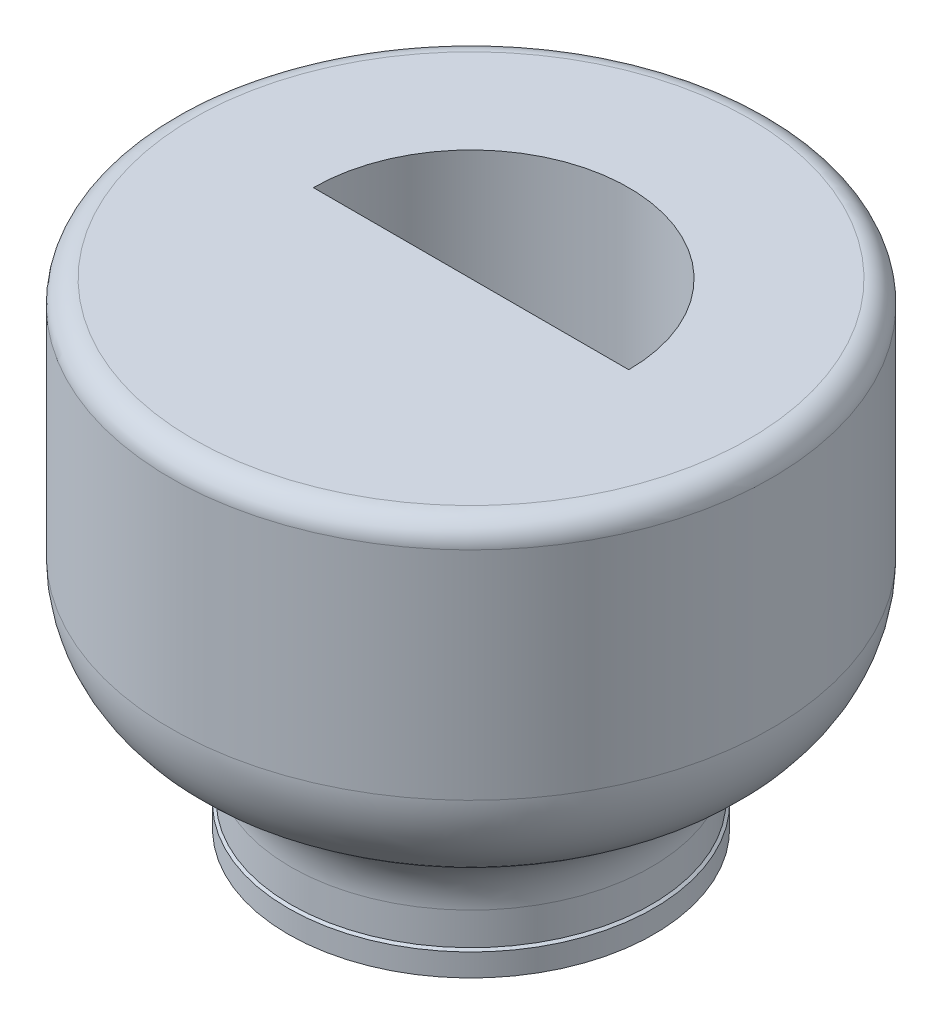
ISO-10303-21;
HEADER;
FILE_DESCRIPTION(('STEP AP214'),'2;1');
FILE_NAME('part.step','',(''),(''),'','','');
FILE_SCHEMA(('AUTOMOTIVE_DESIGN { 1 0 10303 214 1 1 1 1 }'));
ENDSEC;
DATA;
#1=APPLICATION_CONTEXT('core data for automotive mechanical design processes');
#2=APPLICATION_PROTOCOL_DEFINITION('international standard','automotive_design',2000,#1);
#3=PRODUCT_CONTEXT('',#1,'mechanical');
#4=PRODUCT('Part','Part','',(#3));
#5=PRODUCT_RELATED_PRODUCT_CATEGORY('part','',(#4));
#6=PRODUCT_DEFINITION_FORMATION('','',#4);
#7=PRODUCT_DEFINITION_CONTEXT('part definition',#1,'design');
#8=PRODUCT_DEFINITION('design','',#6,#7);
#9=PRODUCT_DEFINITION_SHAPE('','',#8);
#10=(LENGTH_UNIT() NAMED_UNIT(*) SI_UNIT(.MILLI.,.METRE.));
#11=(NAMED_UNIT(*) PLANE_ANGLE_UNIT() SI_UNIT($,.RADIAN.));
#12=(NAMED_UNIT(*) SI_UNIT($,.STERADIAN.) SOLID_ANGLE_UNIT());
#13=UNCERTAINTY_MEASURE_WITH_UNIT(LENGTH_MEASURE(1.E-05),#10,'distance_accuracy_value','');
#14=(GEOMETRIC_REPRESENTATION_CONTEXT(3) GLOBAL_UNCERTAINTY_ASSIGNED_CONTEXT((#13)) GLOBAL_UNIT_ASSIGNED_CONTEXT((#10,
#11,#12)) REPRESENTATION_CONTEXT('',''));
#15=CARTESIAN_POINT('',(0.,0.,0.));
#16=DIRECTION('',(0.,0.,1.));
#17=DIRECTION('',(1.,0.,0.));
#18=AXIS2_PLACEMENT_3D('',#15,#16,#17);
#19=CARTESIAN_POINT('',(0.,0.,0.));
#20=DIRECTION('',(0.,-1.,0.));
#21=DIRECTION('',(0.,0.,-1.));
#22=AXIS2_PLACEMENT_3D('',#19,#20,#21);
#23=CYLINDRICAL_SURFACE('',#22,22.5);
#24=CARTESIAN_POINT('',(0.,0.,0.));
#25=DIRECTION('',(0.,-1.,0.));
#26=DIRECTION('',(0.,0.,-1.));
#27=AXIS2_PLACEMENT_3D('',#24,#25,#26);
#28=CIRCLE('',#27,22.5);
#29=CARTESIAN_POINT('',(0.,0.,-22.5));
#30=VERTEX_POINT('',#29);
#31=EDGE_CURVE('E121',#30,#30,#28,.T.);
#32=ORIENTED_EDGE('',*,*,#31,.T.);
#33=EDGE_LOOP('',(#32));
#34=FACE_BOUND('',#33,.T.);
#35=CARTESIAN_POINT('',(0.,12.5,0.));
#36=DIRECTION('',(0.,-1.,0.));
#37=DIRECTION('',(0.,0.,-1.));
#38=AXIS2_PLACEMENT_3D('',#35,#36,#37);
#39=CIRCLE('',#38,22.5);
#40=CARTESIAN_POINT('',(0.,12.5,-22.5));
#41=VERTEX_POINT('',#40);
#42=EDGE_CURVE('E167',#41,#41,#39,.T.);
#43=ORIENTED_EDGE('',*,*,#42,.F.);
#44=EDGE_LOOP('',(#43));
#45=FACE_BOUND('',#44,.T.);
#46=ADVANCED_FACE('F42',(#34,#45),#23,.F.);
#47=CARTESIAN_POINT('',(0.,12.5,0.));
#48=DIRECTION('',(0.,-1.,0.));
#49=DIRECTION('',(0.,0.,-1.));
#50=AXIS2_PLACEMENT_3D('',#47,#48,#49);
#51=TOROIDAL_SURFACE('',#50,22.,0.5);
#52=ORIENTED_EDGE('',*,*,#42,.T.);
#53=EDGE_LOOP('',(#52));
#54=FACE_BOUND('',#53,.T.);
#55=CARTESIAN_POINT('',(0.,13.,0.));
#56=DIRECTION('',(0.,-1.,0.));
#57=DIRECTION('',(0.,0.,-1.));
#58=AXIS2_PLACEMENT_3D('',#55,#56,#57);
#59=CIRCLE('',#58,22.);
#60=CARTESIAN_POINT('',(0.,13.,-22.));
#61=VERTEX_POINT('',#60);
#62=EDGE_CURVE('E163',#61,#61,#59,.T.);
#63=ORIENTED_EDGE('',*,*,#62,.F.);
#64=EDGE_LOOP('',(#63));
#65=FACE_BOUND('',#64,.T.);
#66=ADVANCED_FACE('F240',(#54,#65),#51,.F.);
#67=CARTESIAN_POINT('',(0.,13.,0.));
#68=DIRECTION('',(0.,-1.,0.));
#69=DIRECTION('',(0.,0.,-1.));
#70=AXIS2_PLACEMENT_3D('',#67,#68,#69);
#71=PLANE('',#70);
#72=CARTESIAN_POINT('',(0.,13.,0.));
#73=DIRECTION('',(0.,-1.,0.));
#74=DIRECTION('',(0.,0.,1.));
#75=AXIS2_PLACEMENT_3D('',#72,#73,#74);
#76=CIRCLE('',#75,21.);
#77=CARTESIAN_POINT('',(-21.,13.,0.));
#78=VERTEX_POINT('',#77);
#79=CARTESIAN_POINT('',(21.,13.,0.));
#80=VERTEX_POINT('',#79);
#81=EDGE_CURVE('E57',#78,#80,#76,.T.);
#82=ORIENTED_EDGE('',*,*,#81,.F.);
#83=DIRECTION('',(-1.,0.,0.));
#84=VECTOR('',#83,1.);
#85=CARTESIAN_POINT('',(21.,13.,0.));
#86=LINE('',#85,#84);
#87=EDGE_CURVE('E115',#80,#78,#86,.T.);
#88=ORIENTED_EDGE('',*,*,#87,.F.);
#89=EDGE_LOOP('',(#82,#88));
#90=FACE_BOUND('',#89,.T.);
#91=ORIENTED_EDGE('',*,*,#62,.T.);
#92=EDGE_LOOP('',(#91));
#93=FACE_BOUND('',#92,.T.);
#94=ADVANCED_FACE('F181',(#90,#93),#71,.T.);
#95=CARTESIAN_POINT('',(0.,63.4278760968653,0.));
#96=DIRECTION('',(0.,1.,0.));
#97=DIRECTION('',(0.,0.,1.));
#98=AXIS2_PLACEMENT_3D('',#95,#96,#97);
#99=PLANE('',#98);
#100=CARTESIAN_POINT('',(0.,63.4278760968653,0.));
#101=DIRECTION('',(0.,1.,0.));
#102=DIRECTION('',(0.,0.,1.));
#103=AXIS2_PLACEMENT_3D('',#100,#101,#102);
#104=CIRCLE('',#103,21.);
#105=CARTESIAN_POINT('',(21.,63.4278760968653,0.));
#106=VERTEX_POINT('',#105);
#107=CARTESIAN_POINT('',(-21.,63.4278760968653,0.));
#108=VERTEX_POINT('',#107);
#109=EDGE_CURVE('E11',#106,#108,#104,.T.);
#110=ORIENTED_EDGE('',*,*,#109,.F.);
#111=DIRECTION('',(1.,0.,0.));
#112=VECTOR('',#111,1.);
#113=CARTESIAN_POINT('',(0.,63.4278760968653,0.));
#114=LINE('',#113,#112);
#115=EDGE_CURVE('E50',#108,#106,#114,.T.);
#116=ORIENTED_EDGE('',*,*,#115,.F.);
#117=EDGE_LOOP('',(#110,#116));
#118=FACE_BOUND('',#117,.T.);
#119=CARTESIAN_POINT('',(0.,63.4278760968653,0.));
#120=DIRECTION('',(0.,-1.,0.));
#121=DIRECTION('',(0.,0.,-1.));
#122=AXIS2_PLACEMENT_3D('',#119,#120,#121);
#123=CIRCLE('',#122,37.);
#124=CARTESIAN_POINT('',(0.,63.4278760968653,-37.));
#125=VERTEX_POINT('',#124);
#126=EDGE_CURVE('E159',#125,#125,#123,.T.);
#127=ORIENTED_EDGE('',*,*,#126,.F.);
#128=EDGE_LOOP('',(#127));
#129=FACE_BOUND('',#128,.T.);
#130=ADVANCED_FACE('F177',(#118,#129),#99,.T.);
#131=CARTESIAN_POINT('',(0.,60.4278760968653,0.));
#132=DIRECTION('',(0.,-1.,0.));
#133=DIRECTION('',(0.,0.,-1.));
#134=AXIS2_PLACEMENT_3D('',#131,#132,#133);
#135=TOROIDAL_SURFACE('',#134,37.,3.);
#136=ORIENTED_EDGE('',*,*,#126,.T.);
#137=EDGE_LOOP('',(#136));
#138=FACE_BOUND('',#137,.T.);
#139=CARTESIAN_POINT('',(0.,60.4278760968653,0.));
#140=DIRECTION('',(0.,-1.,0.));
#141=DIRECTION('',(0.,0.,-1.));
#142=AXIS2_PLACEMENT_3D('',#139,#140,#141);
#143=CIRCLE('',#142,40.);
#144=CARTESIAN_POINT('',(0.,60.4278760968653,-40.));
#145=VERTEX_POINT('',#144);
#146=EDGE_CURVE('E155',#145,#145,#143,.T.);
#147=ORIENTED_EDGE('',*,*,#146,.F.);
#148=EDGE_LOOP('',(#147));
#149=FACE_BOUND('',#148,.T.);
#150=ADVANCED_FACE('F180',(#138,#149),#135,.T.);
#151=CARTESIAN_POINT('',(0.,0.,0.));
#152=DIRECTION('',(0.,-1.,0.));
#153=DIRECTION('',(0.,0.,-1.));
#154=AXIS2_PLACEMENT_3D('',#151,#152,#153);
#155=CYLINDRICAL_SURFACE('',#154,40.);
#156=ORIENTED_EDGE('',*,*,#146,.T.);
#157=EDGE_LOOP('',(#156));
#158=FACE_BOUND('',#157,.T.);
#159=CARTESIAN_POINT('',(0.,31.5562889655761,0.));
#160=DIRECTION('',(0.,-1.,0.));
#161=DIRECTION('',(0.,0.,-1.));
#162=AXIS2_PLACEMENT_3D('',#159,#160,#161);
#163=CIRCLE('',#162,40.);
#164=CARTESIAN_POINT('',(0.,31.5562889655761,-40.));
#165=VERTEX_POINT('',#164);
#166=EDGE_CURVE('E151',#165,#165,#163,.T.);
#167=ORIENTED_EDGE('',*,*,#166,.F.);
#168=EDGE_LOOP('',(#167));
#169=FACE_BOUND('',#168,.T.);
#170=ADVANCED_FACE('F187',(#158,#169),#155,.T.);
#171=CARTESIAN_POINT('',(0.,31.5562889655761,0.));
#172=DIRECTION('',(0.,-1.,0.));
#173=DIRECTION('',(0.,0.,-1.));
#174=AXIS2_PLACEMENT_3D('',#171,#172,#173);
#175=TOROIDAL_SURFACE('',#174,25.,15.);
#176=ORIENTED_EDGE('',*,*,#166,.T.);
#177=EDGE_LOOP('',(#176));
#178=FACE_BOUND('',#177,.T.);
#179=CARTESIAN_POINT('',(0.,18.9896485668923,0.));
#180=DIRECTION('',(0.,-1.,0.));
#181=DIRECTION('',(0.,0.,-1.));
#182=AXIS2_PLACEMENT_3D('',#179,#180,#181);
#183=CIRCLE('',#182,33.1902105644586);
#184=CARTESIAN_POINT('',(0.,18.9896485668923,-33.1902105644586));
#185=VERTEX_POINT('',#184);
#186=EDGE_CURVE('E147',#185,#185,#183,.T.);
#187=ORIENTED_EDGE('',*,*,#186,.F.);
#188=EDGE_LOOP('',(#187));
#189=FACE_BOUND('',#188,.T.);
#190=ADVANCED_FACE('F193',(#178,#189),#175,.T.);
#191=CARTESIAN_POINT('',(0.,15.9588183533154,0.));
#192=DIRECTION('',(0.,1.,0.));
#193=DIRECTION('',(0.,0.,1.));
#194=AXIS2_PLACEMENT_3D('',#191,#192,#193);
#195=CONICAL_SURFACE('',#194,28.5398596236943,0.993197296529964);
#196=ORIENTED_EDGE('',*,*,#186,.T.);
#197=EDGE_LOOP('',(#196));
#198=FACE_BOUND('',#197,.T.);
#199=CARTESIAN_POINT('',(0.,15.9588183533154,0.));
#200=DIRECTION('',(0.,-1.,0.));
#201=DIRECTION('',(0.,0.,-1.));
#202=AXIS2_PLACEMENT_3D('',#199,#200,#201);
#203=CIRCLE('',#202,28.5398596236943);
#204=CARTESIAN_POINT('',(0.,15.9588183533154,-28.5398596236943));
#205=VERTEX_POINT('',#204);
#206=EDGE_CURVE('E143',#205,#205,#203,.T.);
#207=ORIENTED_EDGE('',*,*,#206,.F.);
#208=EDGE_LOOP('',(#207));
#209=FACE_BOUND('',#208,.T.);
#210=ADVANCED_FACE('F199',(#198,#209),#195,.T.);
#211=CARTESIAN_POINT('',(0.,7.58105808752617,0.));
#212=DIRECTION('',(0.,-1.,0.));
#213=DIRECTION('',(0.,0.,-1.));
#214=AXIS2_PLACEMENT_3D('',#211,#212,#213);
#215=TOROIDAL_SURFACE('',#214,34.,10.);
#216=ORIENTED_EDGE('',*,*,#206,.T.);
#217=EDGE_LOOP('',(#216));
#218=FACE_BOUND('',#217,.T.);
#219=CARTESIAN_POINT('',(0.,7.58105808752612,0.));
#220=DIRECTION('',(0.,-1.,0.));
#221=DIRECTION('',(0.,0.,-1.));
#222=AXIS2_PLACEMENT_3D('',#219,#220,#221);
#223=CIRCLE('',#222,24.);
#224=CARTESIAN_POINT('',(0.,7.58105808752612,-24.));
#225=VERTEX_POINT('',#224);
#226=EDGE_CURVE('E139',#225,#225,#223,.T.);
#227=ORIENTED_EDGE('',*,*,#226,.F.);
#228=EDGE_LOOP('',(#227));
#229=FACE_BOUND('',#228,.T.);
#230=ADVANCED_FACE('F205',(#218,#229),#215,.F.);
#231=CARTESIAN_POINT('',(0.,0.,0.));
#232=DIRECTION('',(0.,-1.,0.));
#233=DIRECTION('',(0.,0.,-1.));
#234=AXIS2_PLACEMENT_3D('',#231,#232,#233);
#235=CYLINDRICAL_SURFACE('',#234,24.);
#236=ORIENTED_EDGE('',*,*,#226,.T.);
#237=EDGE_LOOP('',(#236));
#238=FACE_BOUND('',#237,.T.);
#239=CARTESIAN_POINT('',(0.,3.25,0.));
#240=DIRECTION('',(0.,-1.,0.));
#241=DIRECTION('',(0.,0.,-1.));
#242=AXIS2_PLACEMENT_3D('',#239,#240,#241);
#243=CIRCLE('',#242,24.);
#244=CARTESIAN_POINT('',(0.,3.25,-24.));
#245=VERTEX_POINT('',#244);
#246=EDGE_CURVE('E135',#245,#245,#243,.T.);
#247=ORIENTED_EDGE('',*,*,#246,.F.);
#248=EDGE_LOOP('',(#247));
#249=FACE_BOUND('',#248,.T.);
#250=ADVANCED_FACE('F211',(#238,#249),#235,.T.);
#251=CARTESIAN_POINT('',(0.,3.,0.));
#252=DIRECTION('',(0.,-1.,0.));
#253=DIRECTION('',(0.,0.,-1.));
#254=AXIS2_PLACEMENT_3D('',#251,#252,#253);
#255=CONICAL_SURFACE('',#254,24.35,0.950546840812071);
#256=ORIENTED_EDGE('',*,*,#246,.T.);
#257=EDGE_LOOP('',(#256));
#258=FACE_BOUND('',#257,.T.);
#259=CARTESIAN_POINT('',(0.,3.,0.));
#260=DIRECTION('',(0.,-1.,0.));
#261=DIRECTION('',(0.,0.,-1.));
#262=AXIS2_PLACEMENT_3D('',#259,#260,#261);
#263=CIRCLE('',#262,24.35);
#264=CARTESIAN_POINT('',(0.,3.,-24.35));
#265=VERTEX_POINT('',#264);
#266=EDGE_CURVE('E131',#265,#265,#263,.T.);
#267=ORIENTED_EDGE('',*,*,#266,.F.);
#268=EDGE_LOOP('',(#267));
#269=FACE_BOUND('',#268,.T.);
#270=ADVANCED_FACE('F217',(#258,#269),#255,.T.);
#271=CARTESIAN_POINT('',(0.,0.,0.));
#272=DIRECTION('',(0.,-1.,0.));
#273=DIRECTION('',(0.,0.,-1.));
#274=AXIS2_PLACEMENT_3D('',#271,#272,#273);
#275=CYLINDRICAL_SURFACE('',#274,24.35);
#276=ORIENTED_EDGE('',*,*,#266,.T.);
#277=EDGE_LOOP('',(#276));
#278=FACE_BOUND('',#277,.T.);
#279=CARTESIAN_POINT('',(0.,0.,0.));
#280=DIRECTION('',(0.,-1.,0.));
#281=DIRECTION('',(0.,0.,-1.));
#282=AXIS2_PLACEMENT_3D('',#279,#280,#281);
#283=CIRCLE('',#282,24.35);
#284=CARTESIAN_POINT('',(0.,0.,-24.35));
#285=VERTEX_POINT('',#284);
#286=EDGE_CURVE('E127',#285,#285,#283,.T.);
#287=ORIENTED_EDGE('',*,*,#286,.F.);
#288=EDGE_LOOP('',(#287));
#289=FACE_BOUND('',#288,.T.);
#290=ADVANCED_FACE('F223',(#278,#289),#275,.T.);
#291=CARTESIAN_POINT('',(22.5,0.,0.));
#292=DIRECTION('',(0.,-1.,0.));
#293=DIRECTION('',(0.,0.,-1.));
#294=AXIS2_PLACEMENT_3D('',#291,#292,#293);
#295=PLANE('',#294);
#296=ORIENTED_EDGE('',*,*,#286,.T.);
#297=EDGE_LOOP('',(#296));
#298=FACE_BOUND('',#297,.T.);
#299=ORIENTED_EDGE('',*,*,#31,.F.);
#300=EDGE_LOOP('',(#299));
#301=FACE_BOUND('',#300,.T.);
#302=ADVANCED_FACE('F229',(#298,#301),#295,.T.);
#303=CARTESIAN_POINT('',(0.,73.,0.));
#304=DIRECTION('',(0.,-1.,0.));
#305=DIRECTION('',(0.,0.,-1.));
#306=AXIS2_PLACEMENT_3D('',#303,#304,#305);
#307=CYLINDRICAL_SURFACE('',#306,21.);
#308=ORIENTED_EDGE('',*,*,#109,.T.);
#309=DIRECTION('',(0.,-1.,0.));
#310=VECTOR('',#309,1.);
#311=CARTESIAN_POINT('',(-21.,73.,0.));
#312=LINE('',#311,#310);
#313=EDGE_CURVE('E64',#108,#78,#312,.T.);
#314=ORIENTED_EDGE('',*,*,#313,.T.);
#315=ORIENTED_EDGE('',*,*,#81,.T.);
#316=DIRECTION('',(0.,-1.,0.));
#317=VECTOR('',#316,1.);
#318=CARTESIAN_POINT('',(21.,73.,0.));
#319=LINE('',#318,#317);
#320=EDGE_CURVE('E118',#106,#80,#319,.T.);
#321=ORIENTED_EDGE('',*,*,#320,.F.);
#322=EDGE_LOOP('',(#308,#314,#315,#321));
#323=FACE_BOUND('',#322,.T.);
#324=ADVANCED_FACE('F176',(#323),#307,.F.);
#325=CARTESIAN_POINT('',(21.,73.,0.));
#326=DIRECTION('',(0.,0.,1.));
#327=DIRECTION('',(1.,0.,0.));
#328=AXIS2_PLACEMENT_3D('',#325,#326,#327);
#329=PLANE('',#328);
#330=ORIENTED_EDGE('',*,*,#115,.T.);
#331=ORIENTED_EDGE('',*,*,#320,.T.);
#332=ORIENTED_EDGE('',*,*,#87,.T.);
#333=ORIENTED_EDGE('',*,*,#313,.F.);
#334=EDGE_LOOP('',(#330,#331,#332,#333));
#335=FACE_BOUND('',#334,.T.);
#336=ADVANCED_FACE('F172',(#335),#329,.F.);
#337=CLOSED_SHELL('',(#46,#66,#94,#130,#150,#170,#190,#210,#230,#250,#270,#290,#302,#324,#336));
#338=CARTESIAN_POINT('',(0.0221290186607757,62.4278760968653,-0.0548714029169534));
#339=DIRECTION('',(0.,-1.,0.));
#340=DIRECTION('',(0.,0.,-1.));
#341=AXIS2_PLACEMENT_3D('',#338,#339,#340);
#342=CYLINDRICAL_SURFACE('',#341,37.0591655670552);
#343=DIRECTION('',(0.,-1.,0.));
#344=VECTOR('',#343,1.);
#345=CARTESIAN_POINT('',(-37.,62.4278760968653,1.60154504594001));
#346=LINE('',#345,#344);
#347=CARTESIAN_POINT('',(-37.,62.4278760968653,1.60154504594001));
#348=VERTEX_POINT('',#347);
#349=CARTESIAN_POINT('',(-37.,25.4278760968653,1.60154504594001));
#350=VERTEX_POINT('',#349);
#351=EDGE_CURVE('E95',#348,#350,#346,.T.);
#352=ORIENTED_EDGE('',*,*,#351,.F.);
#353=CARTESIAN_POINT('',(0.0221290186607757,62.4278760968653,-0.0548714029169534));
#354=DIRECTION('',(0.,1.,0.));
#355=DIRECTION('',(0.,0.,1.));
#356=AXIS2_PLACEMENT_3D('',#353,#354,#355);
#357=CIRCLE('',#356,37.0591655670552);
#358=CARTESIAN_POINT('',(37.,62.4278760968653,2.39845495405998));
#359=VERTEX_POINT('',#358);
#360=EDGE_CURVE('E91',#348,#359,#357,.T.);
#361=ORIENTED_EDGE('',*,*,#360,.T.);
#362=DIRECTION('',(0.,-1.,0.));
#363=VECTOR('',#362,1.);
#364=CARTESIAN_POINT('',(37.,62.4278760968653,2.39845495405998));
#365=LINE('',#364,#363);
#366=CARTESIAN_POINT('',(37.,25.4278760968653,2.39845495405998));
#367=VERTEX_POINT('',#366);
#368=EDGE_CURVE('E84',#359,#367,#365,.T.);
#369=ORIENTED_EDGE('',*,*,#368,.T.);
#370=CARTESIAN_POINT('',(0.0221290186607757,25.4278760968653,-0.0548714029169534));
#371=DIRECTION('',(0.,1.,0.));
#372=DIRECTION('',(0.,0.,1.));
#373=AXIS2_PLACEMENT_3D('',#370,#371,#372);
#374=CIRCLE('',#373,37.0591655670552);
#375=EDGE_CURVE('E88',#350,#367,#374,.T.);
#376=ORIENTED_EDGE('',*,*,#375,.F.);
#377=EDGE_LOOP('',(#352,#361,#369,#376));
#378=FACE_BOUND('',#377,.T.);
#379=ADVANCED_FACE('F87',(#378),#342,.F.);
#380=CARTESIAN_POINT('',(-37.,62.4278760968653,1.60154504594001));
#381=DIRECTION('',(-0.0107684284097612,0.,0.999942018793882));
#382=DIRECTION('',(0.999942018793882,0.,0.0107684284097612));
#383=AXIS2_PLACEMENT_3D('',#380,#381,#382);
#384=PLANE('',#383);
#385=ORIENTED_EDGE('',*,*,#368,.F.);
#386=DIRECTION('',(-0.999942018793882,0.,-0.0107684284097612));
#387=VECTOR('',#386,1.);
#388=CARTESIAN_POINT('',(-37.,62.4278760968653,1.60154504594001));
#389=LINE('',#388,#387);
#390=EDGE_CURVE('E106',#359,#348,#389,.T.);
#391=ORIENTED_EDGE('',*,*,#390,.T.);
#392=ORIENTED_EDGE('',*,*,#351,.T.);
#393=DIRECTION('',(-0.999942018793882,0.,-0.0107684284097612));
#394=VECTOR('',#393,1.);
#395=CARTESIAN_POINT('',(-37.,25.4278760968653,1.60154504594001));
#396=LINE('',#395,#394);
#397=EDGE_CURVE('E99',#367,#350,#396,.T.);
#398=ORIENTED_EDGE('',*,*,#397,.F.);
#399=EDGE_LOOP('',(#385,#391,#392,#398));
#400=FACE_BOUND('',#399,.T.);
#401=ADVANCED_FACE('F102',(#400),#384,.T.);
#402=CARTESIAN_POINT('',(0.0221290186607757,62.4278760968653,-0.0548714029169534));
#403=DIRECTION('',(0.,1.,0.));
#404=DIRECTION('',(0.,0.,1.));
#405=AXIS2_PLACEMENT_3D('',#402,#403,#404);
#406=PLANE('',#405);
#407=ORIENTED_EDGE('',*,*,#360,.F.);
#408=ORIENTED_EDGE('',*,*,#390,.F.);
#409=EDGE_LOOP('',(#407,#408));
#410=FACE_BOUND('',#409,.T.);
#411=ADVANCED_FACE('F262',(#410),#406,.F.);
#412=CARTESIAN_POINT('',(0.0221290186607757,25.4278760968653,-0.0548714029169534));
#413=DIRECTION('',(0.,1.,0.));
#414=DIRECTION('',(0.,0.,1.));
#415=AXIS2_PLACEMENT_3D('',#412,#413,#414);
#416=PLANE('',#415);
#417=ORIENTED_EDGE('',*,*,#375,.T.);
#418=ORIENTED_EDGE('',*,*,#397,.T.);
#419=EDGE_LOOP('',(#417,#418));
#420=FACE_BOUND('',#419,.T.);
#421=ADVANCED_FACE('F98',(#420),#416,.T.);
#422=CLOSED_SHELL('',(#379,#401,#411,#421));
#423=ORIENTED_CLOSED_SHELL('',*,#337,.T.);
#424=BREP_WITH_VOIDS('B2',#422,(#423));
#425=ADVANCED_BREP_SHAPE_REPRESENTATION('',(#18,#424),#14);
#426=SHAPE_DEFINITION_REPRESENTATION(#9,#425);
ENDSEC;
END-ISO-10303-21;
